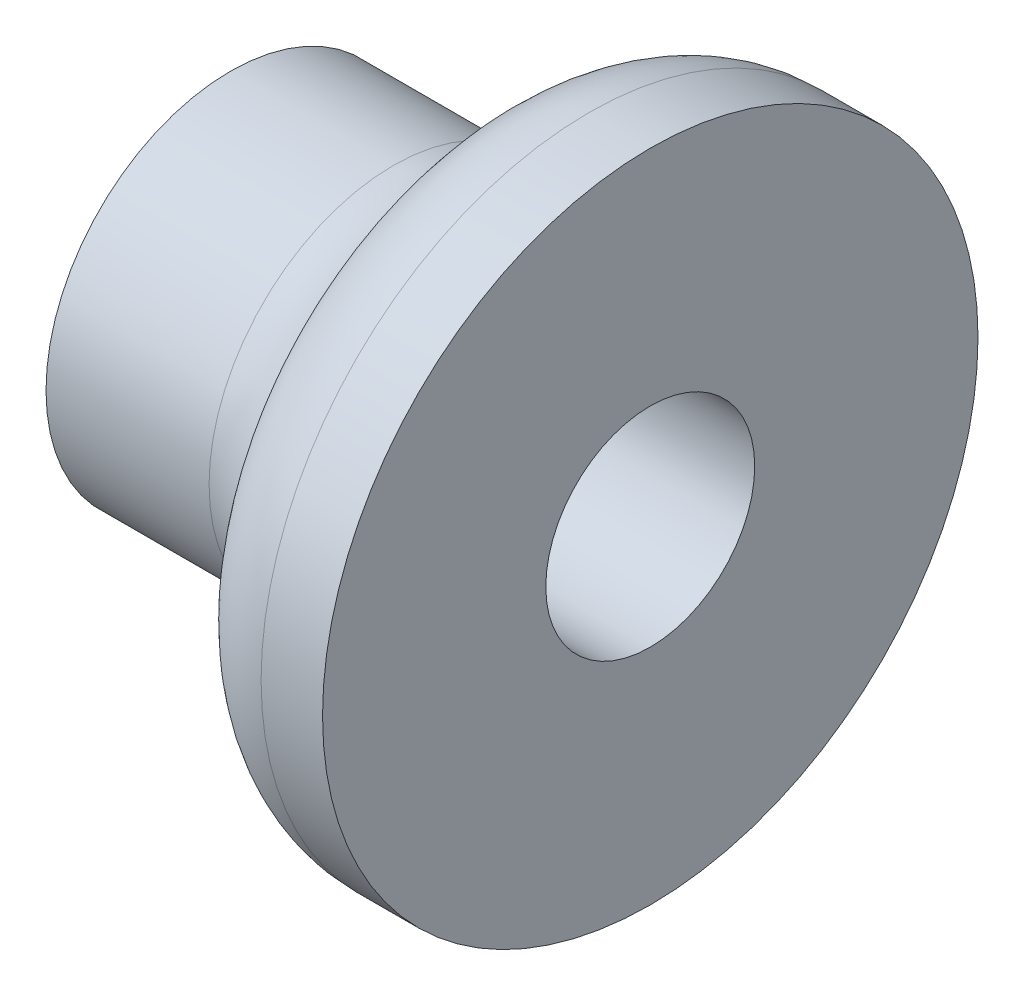
ISO-10303-21;
HEADER;
FILE_DESCRIPTION(('STEP AP214'),'2;1');
FILE_NAME('part.step','',(''),(''),'','','');
FILE_SCHEMA(('AUTOMOTIVE_DESIGN { 1 0 10303 214 1 1 1 1 }'));
ENDSEC;
DATA;
#1=APPLICATION_CONTEXT('core data for automotive mechanical design processes');
#2=APPLICATION_PROTOCOL_DEFINITION('international standard','automotive_design',2000,#1);
#3=PRODUCT_CONTEXT('',#1,'mechanical');
#4=PRODUCT('Part','Part','',(#3));
#5=PRODUCT_RELATED_PRODUCT_CATEGORY('part','',(#4));
#6=PRODUCT_DEFINITION_FORMATION('','',#4);
#7=PRODUCT_DEFINITION_CONTEXT('part definition',#1,'design');
#8=PRODUCT_DEFINITION('design','',#6,#7);
#9=PRODUCT_DEFINITION_SHAPE('','',#8);
#10=(LENGTH_UNIT() NAMED_UNIT(*) SI_UNIT(.MILLI.,.METRE.));
#11=(NAMED_UNIT(*) PLANE_ANGLE_UNIT() SI_UNIT($,.RADIAN.));
#12=(NAMED_UNIT(*) SI_UNIT($,.STERADIAN.) SOLID_ANGLE_UNIT());
#13=UNCERTAINTY_MEASURE_WITH_UNIT(LENGTH_MEASURE(1.E-05),#10,'distance_accuracy_value','');
#14=(GEOMETRIC_REPRESENTATION_CONTEXT(3) GLOBAL_UNCERTAINTY_ASSIGNED_CONTEXT((#13)) GLOBAL_UNIT_ASSIGNED_CONTEXT((#10,
#11,#12)) REPRESENTATION_CONTEXT('',''));
#15=CARTESIAN_POINT('',(0.,0.,0.));
#16=DIRECTION('',(0.,0.,1.));
#17=DIRECTION('',(1.,0.,0.));
#18=AXIS2_PLACEMENT_3D('',#15,#16,#17);
#19=CARTESIAN_POINT('',(34.,0.,0.));
#20=DIRECTION('',(-1.,0.,0.));
#21=DIRECTION('',(0.,0.,1.));
#22=AXIS2_PLACEMENT_3D('',#19,#20,#21);
#23=CYLINDRICAL_SURFACE('',#22,2.55);
#24=CARTESIAN_POINT('',(10.25,0.,0.));
#25=DIRECTION('',(1.,0.,0.));
#26=DIRECTION('',(0.,0.,-1.));
#27=AXIS2_PLACEMENT_3D('',#24,#25,#26);
#28=CIRCLE('',#27,2.55);
#29=CARTESIAN_POINT('',(10.25,0.,-2.55));
#30=VERTEX_POINT('',#29);
#31=EDGE_CURVE('E56',#30,#30,#28,.T.);
#32=ORIENTED_EDGE('',*,*,#31,.T.);
#33=EDGE_LOOP('',(#32));
#34=FACE_BOUND('',#33,.T.);
#35=CARTESIAN_POINT('',(0.7,0.,0.));
#36=DIRECTION('',(-1.,0.,0.));
#37=DIRECTION('',(0.,0.,1.));
#38=AXIS2_PLACEMENT_3D('',#35,#36,#37);
#39=CIRCLE('',#38,2.55);
#40=CARTESIAN_POINT('',(0.7,0.,2.55));
#41=VERTEX_POINT('',#40);
#42=EDGE_CURVE('E66',#41,#41,#39,.T.);
#43=ORIENTED_EDGE('',*,*,#42,.T.);
#44=EDGE_LOOP('',(#43));
#45=FACE_BOUND('',#44,.T.);
#46=ADVANCED_FACE('F36',(#34,#45),#23,.F.);
#47=CARTESIAN_POINT('',(10.25,0.,0.));
#48=DIRECTION('',(-1.,0.,0.));
#49=DIRECTION('',(0.,0.,1.));
#50=AXIS2_PLACEMENT_3D('',#47,#48,#49);
#51=CYLINDRICAL_SURFACE('',#50,4.5);
#52=CARTESIAN_POINT('',(3.98030399291527,0.,0.));
#53=DIRECTION('',(1.,0.,0.));
#54=DIRECTION('',(0.,0.,-1.));
#55=AXIS2_PLACEMENT_3D('',#52,#53,#54);
#56=CIRCLE('',#55,4.5);
#57=CARTESIAN_POINT('',(3.98030399291527,0.,-4.5));
#58=VERTEX_POINT('',#57);
#59=EDGE_CURVE('E10',#58,#58,#56,.F.);
#60=ORIENTED_EDGE('',*,*,#59,.T.);
#61=EDGE_LOOP('',(#60));
#62=FACE_BOUND('',#61,.T.);
#63=CARTESIAN_POINT('',(0.,0.,0.));
#64=DIRECTION('',(1.,0.,0.));
#65=DIRECTION('',(0.,0.,-1.));
#66=AXIS2_PLACEMENT_3D('',#63,#64,#65);
#67=CIRCLE('',#66,4.5);
#68=CARTESIAN_POINT('',(0.,0.,-4.5));
#69=VERTEX_POINT('',#68);
#70=EDGE_CURVE('E51',#69,#69,#67,.T.);
#71=ORIENTED_EDGE('',*,*,#70,.T.);
#72=EDGE_LOOP('',(#71));
#73=FACE_BOUND('',#72,.T.);
#74=ADVANCED_FACE('F93',(#62,#73),#51,.T.);
#75=CARTESIAN_POINT('',(10.25,0.,0.));
#76=DIRECTION('',(1.,0.,0.));
#77=DIRECTION('',(0.,0.,-1.));
#78=AXIS2_PLACEMENT_3D('',#75,#76,#77);
#79=PLANE('',#78);
#80=ORIENTED_EDGE('',*,*,#31,.F.);
#81=EDGE_LOOP('',(#80));
#82=FACE_BOUND('',#81,.T.);
#83=CARTESIAN_POINT('',(10.25,0.,0.));
#84=DIRECTION('',(1.,0.,0.));
#85=DIRECTION('',(0.,0.,-1.));
#86=AXIS2_PLACEMENT_3D('',#83,#84,#85);
#87=CIRCLE('',#86,8.);
#88=CARTESIAN_POINT('',(10.25,0.,-8.));
#89=VERTEX_POINT('',#88);
#90=EDGE_CURVE('E59',#89,#89,#87,.T.);
#91=ORIENTED_EDGE('',*,*,#90,.T.);
#92=EDGE_LOOP('',(#91));
#93=FACE_BOUND('',#92,.T.);
#94=ADVANCED_FACE('F89',(#82,#93),#79,.T.);
#95=CARTESIAN_POINT('',(0.,0.,0.));
#96=DIRECTION('',(1.,0.,0.));
#97=DIRECTION('',(0.,0.,-1.));
#98=AXIS2_PLACEMENT_3D('',#95,#96,#97);
#99=PLANE('',#98);
#100=CARTESIAN_POINT('',(0.,0.,0.));
#101=DIRECTION('',(-1.,0.,0.));
#102=DIRECTION('',(0.,0.,1.));
#103=AXIS2_PLACEMENT_3D('',#100,#101,#102);
#104=CIRCLE('',#103,3.);
#105=CARTESIAN_POINT('',(0.,0.,3.));
#106=VERTEX_POINT('',#105);
#107=EDGE_CURVE('E63',#106,#106,#104,.T.);
#108=ORIENTED_EDGE('',*,*,#107,.F.);
#109=EDGE_LOOP('',(#108));
#110=FACE_BOUND('',#109,.T.);
#111=ORIENTED_EDGE('',*,*,#70,.F.);
#112=EDGE_LOOP('',(#111));
#113=FACE_BOUND('',#112,.T.);
#114=ADVANCED_FACE('F85',(#110,#113),#99,.F.);
#115=CARTESIAN_POINT('',(6.25,0.,0.));
#116=DIRECTION('',(1.,0.,0.));
#117=DIRECTION('',(0.,0.,-1.));
#118=AXIS2_PLACEMENT_3D('',#115,#116,#117);
#119=CYLINDRICAL_SURFACE('',#118,8.);
#120=CARTESIAN_POINT('',(8.75,0.,0.));
#121=DIRECTION('',(1.,0.,0.));
#122=DIRECTION('',(0.,0.,-1.));
#123=AXIS2_PLACEMENT_3D('',#120,#121,#122);
#124=CIRCLE('',#123,8.);
#125=CARTESIAN_POINT('',(8.75,0.,-8.));
#126=VERTEX_POINT('',#125);
#127=EDGE_CURVE('E47',#126,#126,#124,.T.);
#128=ORIENTED_EDGE('',*,*,#127,.T.);
#129=EDGE_LOOP('',(#128));
#130=FACE_BOUND('',#129,.T.);
#131=ORIENTED_EDGE('',*,*,#90,.F.);
#132=EDGE_LOOP('',(#131));
#133=FACE_BOUND('',#132,.T.);
#134=ADVANCED_FACE('F88',(#130,#133),#119,.T.);
#135=CARTESIAN_POINT('',(8.75,0.,0.));
#136=DIRECTION('',(1.,0.,0.));
#137=DIRECTION('',(0.,0.,-1.));
#138=AXIS2_PLACEMENT_3D('',#135,#136,#137);
#139=TOROIDAL_SURFACE('',#138,5.5,2.5);
#140=CARTESIAN_POINT('',(6.36515199645764,0.,0.));
#141=DIRECTION('',(1.,0.,0.));
#142=DIRECTION('',(0.,0.,-1.));
#143=AXIS2_PLACEMENT_3D('',#140,#141,#142);
#144=CIRCLE('',#143,6.25);
#145=CARTESIAN_POINT('',(6.36515199645764,0.,-6.25));
#146=VERTEX_POINT('',#145);
#147=EDGE_CURVE('E43',#146,#146,#144,.T.);
#148=ORIENTED_EDGE('',*,*,#147,.T.);
#149=EDGE_LOOP('',(#148));
#150=FACE_BOUND('',#149,.T.);
#151=ORIENTED_EDGE('',*,*,#127,.F.);
#152=EDGE_LOOP('',(#151));
#153=FACE_BOUND('',#152,.T.);
#154=ADVANCED_FACE('F104',(#150,#153),#139,.T.);
#155=CARTESIAN_POINT('',(3.98030399291527,0.,0.));
#156=DIRECTION('',(1.,0.,0.));
#157=DIRECTION('',(0.,0.,-1.));
#158=AXIS2_PLACEMENT_3D('',#155,#156,#157);
#159=TOROIDAL_SURFACE('',#158,7.,2.5);
#160=ORIENTED_EDGE('',*,*,#59,.F.);
#161=EDGE_LOOP('',(#160));
#162=FACE_BOUND('',#161,.T.);
#163=ORIENTED_EDGE('',*,*,#147,.F.);
#164=EDGE_LOOP('',(#163));
#165=FACE_BOUND('',#164,.T.);
#166=ADVANCED_FACE('F38',(#162,#165),#159,.F.);
#167=CARTESIAN_POINT('',(0.7,0.,0.));
#168=DIRECTION('',(-1.,0.,0.));
#169=DIRECTION('',(0.,0.,1.));
#170=AXIS2_PLACEMENT_3D('',#167,#168,#169);
#171=CYLINDRICAL_SURFACE('',#170,3.);
#172=CARTESIAN_POINT('',(0.7,0.,0.));
#173=DIRECTION('',(-1.,0.,0.));
#174=DIRECTION('',(0.,0.,1.));
#175=AXIS2_PLACEMENT_3D('',#172,#173,#174);
#176=CIRCLE('',#175,3.);
#177=CARTESIAN_POINT('',(0.7,0.,3.));
#178=VERTEX_POINT('',#177);
#179=EDGE_CURVE('E62',#178,#178,#176,.T.);
#180=ORIENTED_EDGE('',*,*,#179,.F.);
#181=EDGE_LOOP('',(#180));
#182=FACE_BOUND('',#181,.T.);
#183=ORIENTED_EDGE('',*,*,#107,.T.);
#184=EDGE_LOOP('',(#183));
#185=FACE_BOUND('',#184,.T.);
#186=ADVANCED_FACE('F76',(#182,#185),#171,.F.);
#187=CARTESIAN_POINT('',(0.7,0.,0.));
#188=DIRECTION('',(-1.,0.,0.));
#189=DIRECTION('',(0.,0.,1.));
#190=AXIS2_PLACEMENT_3D('',#187,#188,#189);
#191=PLANE('',#190);
#192=ORIENTED_EDGE('',*,*,#42,.F.);
#193=EDGE_LOOP('',(#192));
#194=FACE_BOUND('',#193,.T.);
#195=ORIENTED_EDGE('',*,*,#179,.T.);
#196=EDGE_LOOP('',(#195));
#197=FACE_BOUND('',#196,.T.);
#198=ADVANCED_FACE('F73',(#194,#197),#191,.T.);
#199=CLOSED_SHELL('',(#46,#74,#94,#114,#134,#154,#166,#186,#198));
#200=MANIFOLD_SOLID_BREP('B2',#199);
#201=ADVANCED_BREP_SHAPE_REPRESENTATION('',(#18,#200),#14);
#202=SHAPE_DEFINITION_REPRESENTATION(#9,#201);
ENDSEC;
END-ISO-10303-21;
